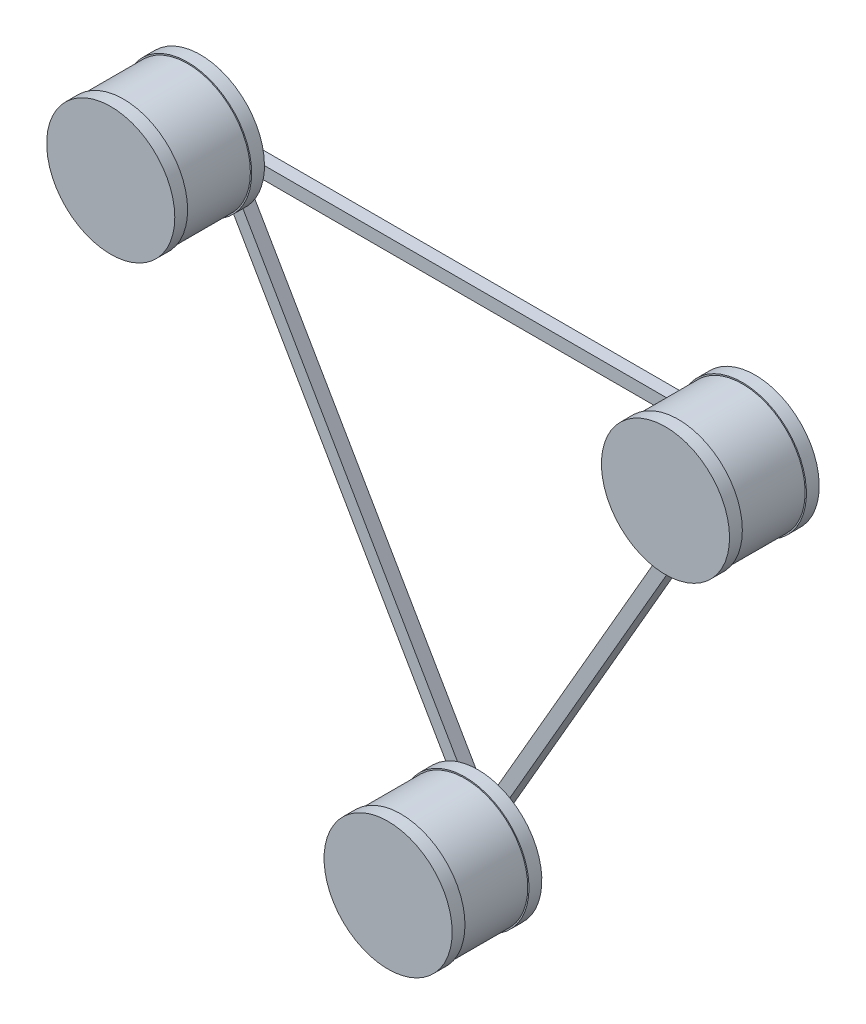
ISO-10303-21;
HEADER;
FILE_DESCRIPTION(('STEP AP214'),'2;1');
FILE_NAME('part.step','',(''),(''),'','','');
FILE_SCHEMA(('AUTOMOTIVE_DESIGN { 1 0 10303 214 1 1 1 1 }'));
ENDSEC;
DATA;
#1=APPLICATION_CONTEXT('core data for automotive mechanical design processes');
#2=APPLICATION_PROTOCOL_DEFINITION('international standard','automotive_design',2000,#1);
#3=PRODUCT_CONTEXT('',#1,'mechanical');
#4=PRODUCT('Part','Part','',(#3));
#5=PRODUCT_RELATED_PRODUCT_CATEGORY('part','',(#4));
#6=PRODUCT_DEFINITION_FORMATION('','',#4);
#7=PRODUCT_DEFINITION_CONTEXT('part definition',#1,'design');
#8=PRODUCT_DEFINITION('design','',#6,#7);
#9=PRODUCT_DEFINITION_SHAPE('','',#8);
#10=(LENGTH_UNIT() NAMED_UNIT(*) SI_UNIT(.MILLI.,.METRE.));
#11=(NAMED_UNIT(*) PLANE_ANGLE_UNIT() SI_UNIT($,.RADIAN.));
#12=(NAMED_UNIT(*) SI_UNIT($,.STERADIAN.) SOLID_ANGLE_UNIT());
#13=UNCERTAINTY_MEASURE_WITH_UNIT(LENGTH_MEASURE(1.E-05),#10,'distance_accuracy_value','');
#14=(GEOMETRIC_REPRESENTATION_CONTEXT(3) GLOBAL_UNCERTAINTY_ASSIGNED_CONTEXT((#13)) GLOBAL_UNIT_ASSIGNED_CONTEXT((#10,
#11,#12)) REPRESENTATION_CONTEXT('',''));
#15=CARTESIAN_POINT('',(0.,0.,0.));
#16=DIRECTION('',(0.,0.,1.));
#17=DIRECTION('',(1.,0.,0.));
#18=AXIS2_PLACEMENT_3D('',#15,#16,#17);
#19=CARTESIAN_POINT('',(0.,0.,2.5));
#20=DIRECTION('',(0.,0.,-1.));
#21=DIRECTION('',(-1.,0.,0.));
#22=AXIS2_PLACEMENT_3D('',#19,#20,#21);
#23=PLANE('',#22);
#24=CARTESIAN_POINT('',(1.79023462720806E-12,-125.,2.5));
#25=DIRECTION('',(0.,0.,1.));
#26=DIRECTION('',(1.,0.,0.));
#27=AXIS2_PLACEMENT_3D('',#24,#25,#26);
#28=CIRCLE('',#27,25.);
#29=CARTESIAN_POINT('',(12.5000000000016,-103.349364905389,2.5));
#30=VERTEX_POINT('',#29);
#31=CARTESIAN_POINT('',(7.91732169499531,-101.286796564404,2.5));
#32=VERTEX_POINT('',#31);
#33=EDGE_CURVE('E147',#30,#32,#28,.T.);
#34=ORIENTED_EDGE('',*,*,#33,.F.);
#35=DIRECTION('',(0.499999999999992,0.866025403784443,0.));
#36=VECTOR('',#35,1.);
#37=CARTESIAN_POINT('',(108.253175473055,62.5000000000005,2.5));
#38=LINE('',#37,#36);
#39=CARTESIAN_POINT('',(95.7531754730548,40.8493649053894,2.5));
#40=VERTEX_POINT('',#39);
#41=EDGE_CURVE('E140',#30,#40,#38,.T.);
#42=ORIENTED_EDGE('',*,*,#41,.T.);
#43=CARTESIAN_POINT('',(108.253175473055,62.5000000000005,2.5));
#44=DIRECTION('',(0.,0.,1.));
#45=DIRECTION('',(-1.,0.,0.));
#46=AXIS2_PLACEMENT_3D('',#43,#44,#45);
#47=CIRCLE('',#46,25.);
#48=CARTESIAN_POINT('',(91.6755997402167,43.7867965644039,2.5));
#49=VERTEX_POINT('',#48);
#50=EDGE_CURVE('E336',#49,#40,#47,.T.);
#51=ORIENTED_EDGE('',*,*,#50,.F.);
#52=DIRECTION('',(0.499999999999992,0.866025403784443,0.));
#53=VECTOR('',#52,1.);
#54=CARTESIAN_POINT('',(99.5929214352103,57.5000000000005,2.5));
#55=LINE('',#54,#53);
#56=EDGE_CURVE('E156',#32,#49,#55,.T.);
#57=ORIENTED_EDGE('',*,*,#56,.F.);
#58=EDGE_LOOP('',(#34,#42,#51,#57));
#59=FACE_BOUND('',#58,.T.);
#60=ADVANCED_FACE('F36',(#59),#23,.F.);
#61=CARTESIAN_POINT('',(83.2531754730546,62.5000000000005,2.5));
#62=VERTEX_POINT('',#61);
#63=CARTESIAN_POINT('',(83.7582780452227,57.5000000000005,2.5));
#64=VERTEX_POINT('',#63);
#65=EDGE_CURVE('E52',#62,#64,#47,.T.);
#66=ORIENTED_EDGE('',*,*,#65,.F.);
#67=DIRECTION('',(-1.,0.,0.));
#68=VECTOR('',#67,1.);
#69=CARTESIAN_POINT('',(-108.253175473055,62.5000000000005,2.5));
#70=LINE('',#69,#68);
#71=CARTESIAN_POINT('',(-83.2531754730546,62.5000000000005,2.5));
#72=VERTEX_POINT('',#71);
#73=EDGE_CURVE('E174',#62,#72,#70,.T.);
#74=ORIENTED_EDGE('',*,*,#73,.T.);
#75=CARTESIAN_POINT('',(-108.253175473055,62.5000000000005,2.5));
#76=DIRECTION('',(0.,0.,1.));
#77=DIRECTION('',(1.,0.,0.));
#78=AXIS2_PLACEMENT_3D('',#75,#76,#77);
#79=CIRCLE('',#78,25.);
#80=CARTESIAN_POINT('',(-83.7582780452228,57.5000000000005,2.5));
#81=VERTEX_POINT('',#80);
#82=EDGE_CURVE('E189',#81,#72,#79,.T.);
#83=ORIENTED_EDGE('',*,*,#82,.F.);
#84=DIRECTION('',(-1.,0.,0.));
#85=VECTOR('',#84,1.);
#86=CARTESIAN_POINT('',(-99.59292143521,57.5000000000005,2.5));
#87=LINE('',#86,#85);
#88=EDGE_CURVE('E60',#64,#81,#87,.T.);
#89=ORIENTED_EDGE('',*,*,#88,.F.);
#90=EDGE_LOOP('',(#66,#74,#83,#89));
#91=FACE_BOUND('',#90,.T.);
#92=ADVANCED_FACE('F337',(#91),#23,.F.);
#93=CARTESIAN_POINT('',(-7.91732169499188,-101.286796564404,2.5));
#94=VERTEX_POINT('',#93);
#95=CARTESIAN_POINT('',(-12.4999999999983,-103.349364905389,2.5));
#96=VERTEX_POINT('',#95);
#97=EDGE_CURVE('E150',#94,#96,#28,.T.);
#98=ORIENTED_EDGE('',*,*,#97,.F.);
#99=DIRECTION('',(0.500000000000004,-0.866025403784436,0.));
#100=VECTOR('',#99,1.);
#101=CARTESIAN_POINT('',(1.82611279708243E-12,-115.,2.5));
#102=LINE('',#101,#100);
#103=CARTESIAN_POINT('',(-91.6755997402163,43.7867965644043,2.5));
#104=VERTEX_POINT('',#103);
#105=EDGE_CURVE('E275',#104,#94,#102,.T.);
#106=ORIENTED_EDGE('',*,*,#105,.F.);
#107=CARTESIAN_POINT('',(-95.7531754730545,40.8493649053896,2.5));
#108=VERTEX_POINT('',#107);
#109=EDGE_CURVE('E243',#108,#104,#79,.T.);
#110=ORIENTED_EDGE('',*,*,#109,.F.);
#111=DIRECTION('',(0.500000000000004,-0.866025403784436,0.));
#112=VECTOR('',#111,1.);
#113=CARTESIAN_POINT('',(1.79023462720806E-12,-125.,2.5));
#114=LINE('',#113,#112);
#115=EDGE_CURVE('E173',#108,#96,#114,.T.);
#116=ORIENTED_EDGE('',*,*,#115,.T.);
#117=EDGE_LOOP('',(#98,#106,#110,#116));
#118=FACE_BOUND('',#117,.T.);
#119=ADVANCED_FACE('F305',(#118),#23,.F.);
#120=CARTESIAN_POINT('',(0.,0.,-2.5));
#121=DIRECTION('',(0.,0.,-1.));
#122=DIRECTION('',(-1.,0.,0.));
#123=AXIS2_PLACEMENT_3D('',#120,#121,#122);
#124=PLANE('',#123);
#125=DIRECTION('',(0.499999999999992,0.866025403784443,0.));
#126=VECTOR('',#125,1.);
#127=CARTESIAN_POINT('',(108.253175473055,62.5000000000005,-2.5));
#128=LINE('',#127,#126);
#129=CARTESIAN_POINT('',(1.79023462720806E-12,-125.,-2.5));
#130=VERTEX_POINT('',#129);
#131=CARTESIAN_POINT('',(108.253175473055,62.5000000000005,-2.5));
#132=VERTEX_POINT('',#131);
#133=EDGE_CURVE('E179',#130,#132,#128,.T.);
#134=ORIENTED_EDGE('',*,*,#133,.F.);
#135=DIRECTION('',(0.500000000000004,-0.866025403784436,0.));
#136=VECTOR('',#135,1.);
#137=CARTESIAN_POINT('',(1.79023462720806E-12,-125.,-2.5));
#138=LINE('',#137,#136);
#139=CARTESIAN_POINT('',(-108.253175473055,62.5000000000005,-2.5));
#140=VERTEX_POINT('',#139);
#141=EDGE_CURVE('E164',#140,#130,#138,.T.);
#142=ORIENTED_EDGE('',*,*,#141,.F.);
#143=DIRECTION('',(-1.,0.,0.));
#144=VECTOR('',#143,1.);
#145=CARTESIAN_POINT('',(-108.253175473055,62.5000000000005,-2.5));
#146=LINE('',#145,#144);
#147=EDGE_CURVE('E165',#132,#140,#146,.T.);
#148=ORIENTED_EDGE('',*,*,#147,.F.);
#149=EDGE_LOOP('',(#134,#142,#148));
#150=FACE_BOUND('',#149,.T.);
#151=DIRECTION('',(0.500000000000004,-0.866025403784436,0.));
#152=VECTOR('',#151,1.);
#153=CARTESIAN_POINT('',(1.82611279708243E-12,-115.,-2.5));
#154=LINE('',#153,#152);
#155=CARTESIAN_POINT('',(-99.59292143521,57.5000000000005,-2.5));
#156=VERTEX_POINT('',#155);
#157=CARTESIAN_POINT('',(1.8249290967276E-12,-115.,-2.5));
#158=VERTEX_POINT('',#157);
#159=EDGE_CURVE('E281',#156,#158,#154,.T.);
#160=ORIENTED_EDGE('',*,*,#159,.T.);
#161=DIRECTION('',(0.499999999999992,0.866025403784443,0.));
#162=VECTOR('',#161,1.);
#163=CARTESIAN_POINT('',(99.5929214352103,57.5000000000005,-2.5));
#164=LINE('',#163,#162);
#165=CARTESIAN_POINT('',(99.5929214352103,57.5000000000005,-2.5));
#166=VERTEX_POINT('',#165);
#167=EDGE_CURVE('E261',#158,#166,#164,.T.);
#168=ORIENTED_EDGE('',*,*,#167,.T.);
#169=DIRECTION('',(-1.,0.,0.));
#170=VECTOR('',#169,1.);
#171=CARTESIAN_POINT('',(-99.59292143521,57.5000000000005,-2.5));
#172=LINE('',#171,#170);
#173=EDGE_CURVE('E278',#166,#156,#172,.T.);
#174=ORIENTED_EDGE('',*,*,#173,.T.);
#175=EDGE_LOOP('',(#160,#168,#174));
#176=FACE_BOUND('',#175,.T.);
#177=ADVANCED_FACE('F295',(#150,#176),#124,.T.);
#178=CARTESIAN_POINT('',(108.253175473055,62.5000000000005,2.5));
#179=DIRECTION('',(-0.866025403784443,0.499999999999992,0.));
#180=DIRECTION('',(-0.499999999999992,-0.866025403784443,0.));
#181=AXIS2_PLACEMENT_3D('',#178,#179,#180);
#182=PLANE('',#181);
#183=ORIENTED_EDGE('',*,*,#133,.T.);
#184=DIRECTION('',(0.,0.,-1.));
#185=VECTOR('',#184,1.);
#186=CARTESIAN_POINT('',(108.253175473055,62.5000000000005,2.5));
#187=LINE('',#186,#185);
#188=CARTESIAN_POINT('',(108.253175473055,62.5000000000005,2.5));
#189=VERTEX_POINT('',#188);
#190=EDGE_CURVE('E186',#189,#132,#187,.T.);
#191=ORIENTED_EDGE('',*,*,#190,.F.);
#192=DIRECTION('',(-0.499999999999992,-0.866025403784443,0.));
#193=VECTOR('',#192,1.);
#194=CARTESIAN_POINT('',(108.253175473055,62.5000000000005,2.5));
#195=LINE('',#194,#193);
#196=EDGE_CURVE('E163',#189,#40,#195,.T.);
#197=ORIENTED_EDGE('',*,*,#196,.T.);
#198=ORIENTED_EDGE('',*,*,#41,.F.);
#199=CARTESIAN_POINT('',(1.79106473273126E-12,-125.,2.5));
#200=VERTEX_POINT('',#199);
#201=EDGE_CURVE('E128',#200,#30,#38,.T.);
#202=ORIENTED_EDGE('',*,*,#201,.F.);
#203=DIRECTION('',(0.,0.,-1.));
#204=VECTOR('',#203,1.);
#205=CARTESIAN_POINT('',(1.79023462720806E-12,-125.,2.5));
#206=LINE('',#205,#204);
#207=EDGE_CURVE('E178',#200,#130,#206,.T.);
#208=ORIENTED_EDGE('',*,*,#207,.T.);
#209=EDGE_LOOP('',(#183,#191,#197,#198,#202,#208));
#210=FACE_BOUND('',#209,.T.);
#211=ADVANCED_FACE('F38',(#210),#182,.F.);
#212=CARTESIAN_POINT('',(-108.253175473055,62.5000000000005,2.5));
#213=DIRECTION('',(0.,-1.,0.));
#214=DIRECTION('',(0.,0.,-1.));
#215=AXIS2_PLACEMENT_3D('',#212,#213,#214);
#216=PLANE('',#215);
#217=ORIENTED_EDGE('',*,*,#147,.T.);
#218=DIRECTION('',(0.,0.,-1.));
#219=VECTOR('',#218,1.);
#220=CARTESIAN_POINT('',(-108.253175473055,62.5000000000005,2.5));
#221=LINE('',#220,#219);
#222=CARTESIAN_POINT('',(-108.253175473055,62.5000000000005,2.5));
#223=VERTEX_POINT('',#222);
#224=EDGE_CURVE('E183',#223,#140,#221,.T.);
#225=ORIENTED_EDGE('',*,*,#224,.F.);
#226=EDGE_CURVE('E139',#72,#223,#70,.T.);
#227=ORIENTED_EDGE('',*,*,#226,.F.);
#228=ORIENTED_EDGE('',*,*,#73,.F.);
#229=EDGE_CURVE('E171',#189,#62,#70,.T.);
#230=ORIENTED_EDGE('',*,*,#229,.F.);
#231=ORIENTED_EDGE('',*,*,#190,.T.);
#232=EDGE_LOOP('',(#217,#225,#227,#228,#230,#231));
#233=FACE_BOUND('',#232,.T.);
#234=ADVANCED_FACE('F330',(#233),#216,.F.);
#235=CARTESIAN_POINT('',(1.79023462720806E-12,-125.,2.5));
#236=DIRECTION('',(0.866025403784436,0.500000000000004,0.));
#237=DIRECTION('',(-0.500000000000004,0.866025403784436,0.));
#238=AXIS2_PLACEMENT_3D('',#235,#236,#237);
#239=PLANE('',#238);
#240=ORIENTED_EDGE('',*,*,#141,.T.);
#241=ORIENTED_EDGE('',*,*,#207,.F.);
#242=DIRECTION('',(0.500000000000004,-0.866025403784436,0.));
#243=VECTOR('',#242,1.);
#244=CARTESIAN_POINT('',(1.79023462720806E-12,-125.,2.5));
#245=LINE('',#244,#243);
#246=EDGE_CURVE('E134',#96,#200,#245,.T.);
#247=ORIENTED_EDGE('',*,*,#246,.F.);
#248=ORIENTED_EDGE('',*,*,#115,.F.);
#249=EDGE_CURVE('E175',#223,#108,#114,.T.);
#250=ORIENTED_EDGE('',*,*,#249,.F.);
#251=ORIENTED_EDGE('',*,*,#224,.T.);
#252=EDGE_LOOP('',(#240,#241,#247,#248,#250,#251));
#253=FACE_BOUND('',#252,.T.);
#254=ADVANCED_FACE('F324',(#253),#239,.F.);
#255=CARTESIAN_POINT('',(99.5929214352103,57.5000000000005,2.5));
#256=DIRECTION('',(-0.866025403784443,0.499999999999992,0.));
#257=DIRECTION('',(-0.499999999999992,-0.866025403784443,0.));
#258=AXIS2_PLACEMENT_3D('',#255,#256,#257);
#259=PLANE('',#258);
#260=ORIENTED_EDGE('',*,*,#167,.F.);
#261=DIRECTION('',(0.,0.,-1.));
#262=VECTOR('',#261,1.);
#263=CARTESIAN_POINT('',(1.82611279708243E-12,-115.,2.5));
#264=LINE('',#263,#262);
#265=CARTESIAN_POINT('',(1.82611279708243E-12,-115.,2.5));
#266=VERTEX_POINT('',#265);
#267=EDGE_CURVE('E274',#266,#158,#264,.T.);
#268=ORIENTED_EDGE('',*,*,#267,.F.);
#269=EDGE_CURVE('E265',#266,#32,#55,.T.);
#270=ORIENTED_EDGE('',*,*,#269,.T.);
#271=ORIENTED_EDGE('',*,*,#56,.T.);
#272=DIRECTION('',(-0.499999999999992,-0.866025403784443,0.));
#273=VECTOR('',#272,1.);
#274=CARTESIAN_POINT('',(99.5929214352103,57.5000000000005,2.5));
#275=LINE('',#274,#273);
#276=CARTESIAN_POINT('',(99.5929214352103,57.5000000000005,2.5));
#277=VERTEX_POINT('',#276);
#278=EDGE_CURVE('E251',#277,#49,#275,.T.);
#279=ORIENTED_EDGE('',*,*,#278,.F.);
#280=DIRECTION('',(0.,0.,-1.));
#281=VECTOR('',#280,1.);
#282=CARTESIAN_POINT('',(99.5929214352103,57.5000000000005,2.5));
#283=LINE('',#282,#281);
#284=EDGE_CURVE('E169',#277,#166,#283,.T.);
#285=ORIENTED_EDGE('',*,*,#284,.T.);
#286=EDGE_LOOP('',(#260,#268,#270,#271,#279,#285));
#287=FACE_BOUND('',#286,.T.);
#288=ADVANCED_FACE('F292',(#287),#259,.T.);
#289=CARTESIAN_POINT('',(-99.59292143521,57.5000000000005,2.5));
#290=DIRECTION('',(0.,-1.,0.));
#291=DIRECTION('',(1.,0.,0.));
#292=AXIS2_PLACEMENT_3D('',#289,#290,#291);
#293=PLANE('',#292);
#294=ORIENTED_EDGE('',*,*,#173,.F.);
#295=ORIENTED_EDGE('',*,*,#284,.F.);
#296=EDGE_CURVE('E268',#277,#64,#87,.T.);
#297=ORIENTED_EDGE('',*,*,#296,.T.);
#298=ORIENTED_EDGE('',*,*,#88,.T.);
#299=CARTESIAN_POINT('',(-99.59292143521,57.5000000000005,2.5));
#300=VERTEX_POINT('',#299);
#301=EDGE_CURVE('E267',#81,#300,#87,.T.);
#302=ORIENTED_EDGE('',*,*,#301,.T.);
#303=DIRECTION('',(0.,0.,-1.));
#304=VECTOR('',#303,1.);
#305=CARTESIAN_POINT('',(-99.59292143521,57.5000000000005,2.5));
#306=LINE('',#305,#304);
#307=EDGE_CURVE('E285',#300,#156,#306,.T.);
#308=ORIENTED_EDGE('',*,*,#307,.T.);
#309=EDGE_LOOP('',(#294,#295,#297,#298,#302,#308));
#310=FACE_BOUND('',#309,.T.);
#311=ADVANCED_FACE('F338',(#310),#293,.T.);
#312=CARTESIAN_POINT('',(1.82611279708243E-12,-115.,2.5));
#313=DIRECTION('',(0.866025403784436,0.500000000000004,0.));
#314=DIRECTION('',(-0.500000000000004,0.866025403784436,0.));
#315=AXIS2_PLACEMENT_3D('',#312,#313,#314);
#316=PLANE('',#315);
#317=ORIENTED_EDGE('',*,*,#159,.F.);
#318=ORIENTED_EDGE('',*,*,#307,.F.);
#319=EDGE_CURVE('E271',#300,#104,#102,.T.);
#320=ORIENTED_EDGE('',*,*,#319,.T.);
#321=ORIENTED_EDGE('',*,*,#105,.T.);
#322=EDGE_CURVE('E270',#94,#266,#102,.T.);
#323=ORIENTED_EDGE('',*,*,#322,.T.);
#324=ORIENTED_EDGE('',*,*,#267,.T.);
#325=EDGE_LOOP('',(#317,#318,#320,#321,#323,#324));
#326=FACE_BOUND('',#325,.T.);
#327=ADVANCED_FACE('F297',(#326),#316,.T.);
#328=CARTESIAN_POINT('',(-108.253175473055,62.5000000000005,2.5));
#329=DIRECTION('',(0.,0.,1.));
#330=DIRECTION('',(1.,0.,0.));
#331=AXIS2_PLACEMENT_3D('',#328,#329,#330);
#332=PLANE('',#331);
#333=EDGE_CURVE('E262',#72,#108,#79,.T.);
#334=ORIENTED_EDGE('',*,*,#333,.F.);
#335=ORIENTED_EDGE('',*,*,#226,.T.);
#336=ORIENTED_EDGE('',*,*,#249,.T.);
#337=EDGE_LOOP('',(#334,#335,#336));
#338=FACE_BOUND('',#337,.T.);
#339=ADVANCED_FACE('F320',(#338),#332,.F.);
#340=CARTESIAN_POINT('',(-108.253175473055,62.5000000000005,7.5));
#341=DIRECTION('',(0.,0.,-1.));
#342=DIRECTION('',(-1.,0.,0.));
#343=AXIS2_PLACEMENT_3D('',#340,#341,#342);
#344=CYLINDRICAL_SURFACE('',#343,25.);
#345=CARTESIAN_POINT('',(-108.253175473055,62.5000000000005,7.5));
#346=DIRECTION('',(0.,0.,1.));
#347=DIRECTION('',(1.,0.,0.));
#348=AXIS2_PLACEMENT_3D('',#345,#346,#347);
#349=CIRCLE('',#348,25.);
#350=CARTESIAN_POINT('',(-83.2531754730546,62.5000000000005,7.5));
#351=VERTEX_POINT('',#350);
#352=EDGE_CURVE('E258',#351,#351,#349,.T.);
#353=ORIENTED_EDGE('',*,*,#352,.F.);
#354=EDGE_LOOP('',(#353));
#355=FACE_BOUND('',#354,.T.);
#356=ORIENTED_EDGE('',*,*,#333,.T.);
#357=ORIENTED_EDGE('',*,*,#109,.T.);
#358=EDGE_CURVE('E257',#104,#81,#79,.T.);
#359=ORIENTED_EDGE('',*,*,#358,.T.);
#360=ORIENTED_EDGE('',*,*,#82,.T.);
#361=EDGE_LOOP('',(#356,#357,#359,#360));
#362=FACE_BOUND('',#361,.T.);
#363=ADVANCED_FACE('F315',(#355,#362),#344,.T.);
#364=CARTESIAN_POINT('',(-108.253175473055,62.5000000000005,7.5));
#365=DIRECTION('',(0.,0.,1.));
#366=DIRECTION('',(1.,0.,0.));
#367=AXIS2_PLACEMENT_3D('',#364,#365,#366);
#368=PLANE('',#367);
#369=CARTESIAN_POINT('',(-108.253175473055,62.5000000000005,7.5));
#370=DIRECTION('',(0.,0.,1.));
#371=DIRECTION('',(1.,0.,0.));
#372=AXIS2_PLACEMENT_3D('',#369,#370,#371);
#373=CIRCLE('',#372,24.5);
#374=CARTESIAN_POINT('',(-83.7531754730546,62.5000000000005,7.5));
#375=VERTEX_POINT('',#374);
#376=EDGE_CURVE('E723',#375,#375,#373,.T.);
#377=ORIENTED_EDGE('',*,*,#376,.F.);
#378=EDGE_LOOP('',(#377));
#379=FACE_BOUND('',#378,.T.);
#380=ORIENTED_EDGE('',*,*,#352,.T.);
#381=EDGE_LOOP('',(#380));
#382=FACE_BOUND('',#381,.T.);
#383=ADVANCED_FACE('F408',(#379,#382),#368,.T.);
#384=ORIENTED_EDGE('',*,*,#319,.F.);
#385=ORIENTED_EDGE('',*,*,#301,.F.);
#386=ORIENTED_EDGE('',*,*,#358,.F.);
#387=EDGE_LOOP('',(#384,#385,#386));
#388=FACE_BOUND('',#387,.T.);
#389=ADVANCED_FACE('F312',(#388),#332,.F.);
#390=CARTESIAN_POINT('',(108.253175473055,62.5000000000005,2.5));
#391=DIRECTION('',(0.,0.,-1.));
#392=DIRECTION('',(-1.,0.,0.));
#393=AXIS2_PLACEMENT_3D('',#390,#391,#392);
#394=PLANE('',#393);
#395=ORIENTED_EDGE('',*,*,#196,.F.);
#396=ORIENTED_EDGE('',*,*,#229,.T.);
#397=EDGE_CURVE('E247',#40,#62,#47,.T.);
#398=ORIENTED_EDGE('',*,*,#397,.F.);
#399=EDGE_LOOP('',(#395,#396,#398));
#400=FACE_BOUND('',#399,.T.);
#401=ADVANCED_FACE('F333',(#400),#394,.T.);
#402=CARTESIAN_POINT('',(108.253175473055,62.5000000000005,7.5));
#403=DIRECTION('',(0.,0.,-1.));
#404=DIRECTION('',(-1.,0.,0.));
#405=AXIS2_PLACEMENT_3D('',#402,#403,#404);
#406=CYLINDRICAL_SURFACE('',#405,25.);
#407=CARTESIAN_POINT('',(108.253175473055,62.5000000000005,7.5));
#408=DIRECTION('',(0.,0.,1.));
#409=DIRECTION('',(-1.,0.,0.));
#410=AXIS2_PLACEMENT_3D('',#407,#408,#409);
#411=CIRCLE('',#410,25.);
#412=CARTESIAN_POINT('',(83.2531754730546,62.5000000000005,7.5));
#413=VERTEX_POINT('',#412);
#414=EDGE_CURVE('E248',#413,#413,#411,.T.);
#415=ORIENTED_EDGE('',*,*,#414,.F.);
#416=EDGE_LOOP('',(#415));
#417=FACE_BOUND('',#416,.T.);
#418=ORIENTED_EDGE('',*,*,#65,.T.);
#419=EDGE_CURVE('E253',#64,#49,#47,.T.);
#420=ORIENTED_EDGE('',*,*,#419,.T.);
#421=ORIENTED_EDGE('',*,*,#50,.T.);
#422=ORIENTED_EDGE('',*,*,#397,.T.);
#423=EDGE_LOOP('',(#418,#420,#421,#422));
#424=FACE_BOUND('',#423,.T.);
#425=ADVANCED_FACE('F335',(#417,#424),#406,.T.);
#426=CARTESIAN_POINT('',(108.253175473055,62.5000000000005,7.5));
#427=DIRECTION('',(0.,0.,-1.));
#428=DIRECTION('',(-1.,0.,0.));
#429=AXIS2_PLACEMENT_3D('',#426,#427,#428);
#430=PLANE('',#429);
#431=CARTESIAN_POINT('',(108.253175473055,62.5000000000005,7.50000000000001));
#432=DIRECTION('',(0.,0.,-1.));
#433=DIRECTION('',(-1.,0.,0.));
#434=AXIS2_PLACEMENT_3D('',#431,#432,#433);
#435=CIRCLE('',#434,24.5);
#436=CARTESIAN_POINT('',(83.7531754730545,62.5000000000005,7.50000000000001));
#437=VERTEX_POINT('',#436);
#438=EDGE_CURVE('E200',#437,#437,#435,.F.);
#439=ORIENTED_EDGE('',*,*,#438,.F.);
#440=EDGE_LOOP('',(#439));
#441=FACE_BOUND('',#440,.T.);
#442=ORIENTED_EDGE('',*,*,#414,.T.);
#443=EDGE_LOOP('',(#442));
#444=FACE_BOUND('',#443,.T.);
#445=ADVANCED_FACE('F342',(#441,#444),#430,.F.);
#446=ORIENTED_EDGE('',*,*,#296,.F.);
#447=ORIENTED_EDGE('',*,*,#278,.T.);
#448=ORIENTED_EDGE('',*,*,#419,.F.);
#449=EDGE_LOOP('',(#446,#447,#448));
#450=FACE_BOUND('',#449,.T.);
#451=ADVANCED_FACE('F340',(#450),#394,.T.);
#452=CARTESIAN_POINT('',(1.79023462720806E-12,-125.,2.5));
#453=DIRECTION('',(0.,0.,1.));
#454=DIRECTION('',(1.,0.,0.));
#455=AXIS2_PLACEMENT_3D('',#452,#453,#454);
#456=PLANE('',#455);
#457=ORIENTED_EDGE('',*,*,#246,.T.);
#458=ORIENTED_EDGE('',*,*,#201,.T.);
#459=EDGE_CURVE('E131',#96,#30,#28,.T.);
#460=ORIENTED_EDGE('',*,*,#459,.F.);
#461=EDGE_LOOP('',(#457,#458,#460));
#462=FACE_BOUND('',#461,.T.);
#463=ADVANCED_FACE('F130',(#462),#456,.F.);
#464=CARTESIAN_POINT('',(1.79023462720806E-12,-125.,7.5));
#465=DIRECTION('',(0.,0.,-1.));
#466=DIRECTION('',(-1.,0.,0.));
#467=AXIS2_PLACEMENT_3D('',#464,#465,#466);
#468=CYLINDRICAL_SURFACE('',#467,25.);
#469=CARTESIAN_POINT('',(1.79023462720806E-12,-125.,7.5));
#470=DIRECTION('',(0.,0.,1.));
#471=DIRECTION('',(1.,0.,0.));
#472=AXIS2_PLACEMENT_3D('',#469,#470,#471);
#473=CIRCLE('',#472,25.);
#474=CARTESIAN_POINT('',(25.0000000000018,-125.,7.5));
#475=VERTEX_POINT('',#474);
#476=EDGE_CURVE('E158',#475,#475,#473,.T.);
#477=ORIENTED_EDGE('',*,*,#476,.F.);
#478=EDGE_LOOP('',(#477));
#479=FACE_BOUND('',#478,.T.);
#480=ORIENTED_EDGE('',*,*,#33,.T.);
#481=EDGE_CURVE('E159',#32,#94,#28,.T.);
#482=ORIENTED_EDGE('',*,*,#481,.T.);
#483=ORIENTED_EDGE('',*,*,#97,.T.);
#484=ORIENTED_EDGE('',*,*,#459,.T.);
#485=EDGE_LOOP('',(#480,#482,#483,#484));
#486=FACE_BOUND('',#485,.T.);
#487=ADVANCED_FACE('F145',(#479,#486),#468,.T.);
#488=CARTESIAN_POINT('',(1.79023462720806E-12,-125.,7.5));
#489=DIRECTION('',(0.,0.,1.));
#490=DIRECTION('',(1.,0.,0.));
#491=AXIS2_PLACEMENT_3D('',#488,#489,#490);
#492=PLANE('',#491);
#493=CARTESIAN_POINT('',(1.79023462720806E-12,-125.,7.5));
#494=DIRECTION('',(0.,0.,1.));
#495=DIRECTION('',(1.,0.,0.));
#496=AXIS2_PLACEMENT_3D('',#493,#494,#495);
#497=CIRCLE('',#496,24.5);
#498=CARTESIAN_POINT('',(24.5000000000018,-125.,7.5));
#499=VERTEX_POINT('',#498);
#500=EDGE_CURVE('E747',#499,#499,#497,.T.);
#501=ORIENTED_EDGE('',*,*,#500,.F.);
#502=EDGE_LOOP('',(#501));
#503=FACE_BOUND('',#502,.T.);
#504=ORIENTED_EDGE('',*,*,#476,.T.);
#505=EDGE_LOOP('',(#504));
#506=FACE_BOUND('',#505,.T.);
#507=ADVANCED_FACE('F444',(#503,#506),#492,.T.);
#508=ORIENTED_EDGE('',*,*,#269,.F.);
#509=ORIENTED_EDGE('',*,*,#322,.F.);
#510=ORIENTED_EDGE('',*,*,#481,.F.);
#511=EDGE_LOOP('',(#508,#509,#510));
#512=FACE_BOUND('',#511,.T.);
#513=ADVANCED_FACE('F302',(#512),#456,.F.);
#514=CARTESIAN_POINT('',(-108.253175473055,62.5000000000005,101.796464556282));
#515=DIRECTION('',(0.,0.,-1.));
#516=DIRECTION('',(-1.,0.,0.));
#517=AXIS2_PLACEMENT_3D('',#514,#515,#516);
#518=CYLINDRICAL_SURFACE('',#517,24.5);
#519=ORIENTED_EDGE('',*,*,#376,.T.);
#520=EDGE_LOOP('',(#519));
#521=FACE_BOUND('',#520,.T.);
#522=CARTESIAN_POINT('',(-108.253175473055,62.5000000000005,32.5));
#523=DIRECTION('',(0.,0.,1.));
#524=DIRECTION('',(1.,0.,0.));
#525=AXIS2_PLACEMENT_3D('',#522,#523,#524);
#526=CIRCLE('',#525,24.5);
#527=CARTESIAN_POINT('',(-83.7531754730546,62.5000000000005,32.5));
#528=VERTEX_POINT('',#527);
#529=EDGE_CURVE('E190',#528,#528,#526,.F.);
#530=ORIENTED_EDGE('',*,*,#529,.T.);
#531=EDGE_LOOP('',(#530));
#532=FACE_BOUND('',#531,.T.);
#533=ADVANCED_FACE('F459',(#521,#532),#518,.T.);
#534=CARTESIAN_POINT('',(-108.253175473055,62.5000000000005,37.5));
#535=DIRECTION('',(0.,0.,1.));
#536=DIRECTION('',(1.,0.,0.));
#537=AXIS2_PLACEMENT_3D('',#534,#535,#536);
#538=PLANE('',#537);
#539=CARTESIAN_POINT('',(-108.253175473055,62.5000000000005,37.5));
#540=DIRECTION('',(0.,0.,1.));
#541=DIRECTION('',(1.,0.,0.));
#542=AXIS2_PLACEMENT_3D('',#539,#540,#541);
#543=CIRCLE('',#542,25.);
#544=CARTESIAN_POINT('',(-83.2531754730546,62.5000000000005,37.5));
#545=VERTEX_POINT('',#544);
#546=EDGE_CURVE('E734',#545,#545,#543,.T.);
#547=ORIENTED_EDGE('',*,*,#546,.T.);
#548=EDGE_LOOP('',(#547));
#549=FACE_BOUND('',#548,.T.);
#550=ADVANCED_FACE('F465',(#549),#538,.T.);
#551=CARTESIAN_POINT('',(-108.253175473055,62.5000000000005,37.5));
#552=DIRECTION('',(0.,0.,-1.));
#553=DIRECTION('',(-1.,0.,0.));
#554=AXIS2_PLACEMENT_3D('',#551,#552,#553);
#555=CYLINDRICAL_SURFACE('',#554,25.);
#556=ORIENTED_EDGE('',*,*,#546,.F.);
#557=EDGE_LOOP('',(#556));
#558=FACE_BOUND('',#557,.T.);
#559=CARTESIAN_POINT('',(-108.253175473055,62.5000000000005,32.5));
#560=DIRECTION('',(0.,0.,1.));
#561=DIRECTION('',(1.,0.,0.));
#562=AXIS2_PLACEMENT_3D('',#559,#560,#561);
#563=CIRCLE('',#562,25.);
#564=CARTESIAN_POINT('',(-83.2531754730546,62.5000000000005,32.5));
#565=VERTEX_POINT('',#564);
#566=EDGE_CURVE('E727',#565,#565,#563,.T.);
#567=ORIENTED_EDGE('',*,*,#566,.T.);
#568=EDGE_LOOP('',(#567));
#569=FACE_BOUND('',#568,.T.);
#570=ADVANCED_FACE('F479',(#558,#569),#555,.T.);
#571=CARTESIAN_POINT('',(-108.253175473055,62.5000000000005,32.5));
#572=DIRECTION('',(0.,0.,1.));
#573=DIRECTION('',(1.,0.,0.));
#574=AXIS2_PLACEMENT_3D('',#571,#572,#573);
#575=PLANE('',#574);
#576=ORIENTED_EDGE('',*,*,#529,.F.);
#577=EDGE_LOOP('',(#576));
#578=FACE_BOUND('',#577,.T.);
#579=ORIENTED_EDGE('',*,*,#566,.F.);
#580=EDGE_LOOP('',(#579));
#581=FACE_BOUND('',#580,.T.);
#582=ADVANCED_FACE('F473',(#578,#581),#575,.F.);
#583=CARTESIAN_POINT('',(108.253175473055,62.5000000000005,101.796464556282));
#584=DIRECTION('',(0.,0.,-1.));
#585=DIRECTION('',(-1.,0.,0.));
#586=AXIS2_PLACEMENT_3D('',#583,#584,#585);
#587=CYLINDRICAL_SURFACE('',#586,24.5);
#588=ORIENTED_EDGE('',*,*,#438,.T.);
#589=EDGE_LOOP('',(#588));
#590=FACE_BOUND('',#589,.T.);
#591=CARTESIAN_POINT('',(108.253175473055,62.5000000000005,32.5));
#592=DIRECTION('',(0.,0.,1.));
#593=DIRECTION('',(1.,0.,0.));
#594=AXIS2_PLACEMENT_3D('',#591,#592,#593);
#595=CIRCLE('',#594,24.5);
#596=CARTESIAN_POINT('',(132.753175473055,62.5000000000005,32.5));
#597=VERTEX_POINT('',#596);
#598=EDGE_CURVE('E197',#597,#597,#595,.F.);
#599=ORIENTED_EDGE('',*,*,#598,.T.);
#600=EDGE_LOOP('',(#599));
#601=FACE_BOUND('',#600,.T.);
#602=ADVANCED_FACE('F478',(#590,#601),#587,.T.);
#603=CARTESIAN_POINT('',(108.253175473055,62.5000000000005,37.5));
#604=DIRECTION('',(0.,0.,1.));
#605=DIRECTION('',(1.,0.,0.));
#606=AXIS2_PLACEMENT_3D('',#603,#604,#605);
#607=PLANE('',#606);
#608=CARTESIAN_POINT('',(108.253175473055,62.5000000000005,37.5));
#609=DIRECTION('',(0.,0.,1.));
#610=DIRECTION('',(1.,0.,0.));
#611=AXIS2_PLACEMENT_3D('',#608,#609,#610);
#612=CIRCLE('',#611,25.);
#613=CARTESIAN_POINT('',(133.253175473055,62.5000000000005,37.5));
#614=VERTEX_POINT('',#613);
#615=EDGE_CURVE('E218',#614,#614,#612,.T.);
#616=ORIENTED_EDGE('',*,*,#615,.T.);
#617=EDGE_LOOP('',(#616));
#618=FACE_BOUND('',#617,.T.);
#619=ADVANCED_FACE('F492',(#618),#607,.T.);
#620=CARTESIAN_POINT('',(108.253175473055,62.5000000000005,37.5));
#621=DIRECTION('',(0.,0.,-1.));
#622=DIRECTION('',(-1.,0.,0.));
#623=AXIS2_PLACEMENT_3D('',#620,#621,#622);
#624=CYLINDRICAL_SURFACE('',#623,25.);
#625=ORIENTED_EDGE('',*,*,#615,.F.);
#626=EDGE_LOOP('',(#625));
#627=FACE_BOUND('',#626,.T.);
#628=CARTESIAN_POINT('',(108.253175473055,62.5000000000005,32.5));
#629=DIRECTION('',(0.,0.,1.));
#630=DIRECTION('',(1.,0.,0.));
#631=AXIS2_PLACEMENT_3D('',#628,#629,#630);
#632=CIRCLE('',#631,25.);
#633=CARTESIAN_POINT('',(133.253175473055,62.5000000000005,32.5));
#634=VERTEX_POINT('',#633);
#635=EDGE_CURVE('E224',#634,#634,#632,.T.);
#636=ORIENTED_EDGE('',*,*,#635,.T.);
#637=EDGE_LOOP('',(#636));
#638=FACE_BOUND('',#637,.T.);
#639=ADVANCED_FACE('F505',(#627,#638),#624,.T.);
#640=CARTESIAN_POINT('',(108.253175473055,62.5000000000005,32.5));
#641=DIRECTION('',(0.,0.,1.));
#642=DIRECTION('',(1.,0.,0.));
#643=AXIS2_PLACEMENT_3D('',#640,#641,#642);
#644=PLANE('',#643);
#645=ORIENTED_EDGE('',*,*,#598,.F.);
#646=EDGE_LOOP('',(#645));
#647=FACE_BOUND('',#646,.T.);
#648=ORIENTED_EDGE('',*,*,#635,.F.);
#649=EDGE_LOOP('',(#648));
#650=FACE_BOUND('',#649,.T.);
#651=ADVANCED_FACE('F500',(#647,#650),#644,.F.);
#652=CARTESIAN_POINT('',(1.79023462720806E-12,-125.,101.796464556282));
#653=DIRECTION('',(0.,0.,-1.));
#654=DIRECTION('',(-1.,0.,0.));
#655=AXIS2_PLACEMENT_3D('',#652,#653,#654);
#656=CYLINDRICAL_SURFACE('',#655,24.5);
#657=ORIENTED_EDGE('',*,*,#500,.T.);
#658=EDGE_LOOP('',(#657));
#659=FACE_BOUND('',#658,.T.);
#660=CARTESIAN_POINT('',(1.79023462720806E-12,-125.,32.5));
#661=DIRECTION('',(0.,0.,1.));
#662=DIRECTION('',(1.,0.,0.));
#663=AXIS2_PLACEMENT_3D('',#660,#661,#662);
#664=CIRCLE('',#663,24.5);
#665=CARTESIAN_POINT('',(24.5000000000018,-125.,32.5));
#666=VERTEX_POINT('',#665);
#667=EDGE_CURVE('E45',#666,#666,#664,.F.);
#668=ORIENTED_EDGE('',*,*,#667,.T.);
#669=EDGE_LOOP('',(#668));
#670=FACE_BOUND('',#669,.T.);
#671=ADVANCED_FACE('F205',(#659,#670),#656,.T.);
#672=CARTESIAN_POINT('',(1.79023462720806E-12,-125.,37.5));
#673=DIRECTION('',(0.,0.,1.));
#674=DIRECTION('',(1.,0.,0.));
#675=AXIS2_PLACEMENT_3D('',#672,#673,#674);
#676=PLANE('',#675);
#677=CARTESIAN_POINT('',(1.79023462720806E-12,-125.,37.5));
#678=DIRECTION('',(0.,0.,1.));
#679=DIRECTION('',(1.,0.,0.));
#680=AXIS2_PLACEMENT_3D('',#677,#678,#679);
#681=CIRCLE('',#680,25.);
#682=CARTESIAN_POINT('',(25.0000000000018,-125.,37.5));
#683=VERTEX_POINT('',#682);
#684=EDGE_CURVE('E217',#683,#683,#681,.T.);
#685=ORIENTED_EDGE('',*,*,#684,.T.);
#686=EDGE_LOOP('',(#685));
#687=FACE_BOUND('',#686,.T.);
#688=ADVANCED_FACE('F518',(#687),#676,.T.);
#689=CARTESIAN_POINT('',(1.79023462720806E-12,-125.,37.5));
#690=DIRECTION('',(0.,0.,-1.));
#691=DIRECTION('',(-1.,0.,0.));
#692=AXIS2_PLACEMENT_3D('',#689,#690,#691);
#693=CYLINDRICAL_SURFACE('',#692,25.);
#694=ORIENTED_EDGE('',*,*,#684,.F.);
#695=EDGE_LOOP('',(#694));
#696=FACE_BOUND('',#695,.T.);
#697=CARTESIAN_POINT('',(1.79023462720806E-12,-125.,32.5));
#698=DIRECTION('',(0.,0.,1.));
#699=DIRECTION('',(1.,0.,0.));
#700=AXIS2_PLACEMENT_3D('',#697,#698,#699);
#701=CIRCLE('',#700,25.);
#702=CARTESIAN_POINT('',(25.0000000000018,-125.,32.5));
#703=VERTEX_POINT('',#702);
#704=EDGE_CURVE('E215',#703,#703,#701,.T.);
#705=ORIENTED_EDGE('',*,*,#704,.T.);
#706=EDGE_LOOP('',(#705));
#707=FACE_BOUND('',#706,.T.);
#708=ADVANCED_FACE('F210',(#696,#707),#693,.T.);
#709=CARTESIAN_POINT('',(1.79023462720806E-12,-125.,32.5));
#710=DIRECTION('',(0.,0.,1.));
#711=DIRECTION('',(1.,0.,0.));
#712=AXIS2_PLACEMENT_3D('',#709,#710,#711);
#713=PLANE('',#712);
#714=ORIENTED_EDGE('',*,*,#667,.F.);
#715=EDGE_LOOP('',(#714));
#716=FACE_BOUND('',#715,.T.);
#717=ORIENTED_EDGE('',*,*,#704,.F.);
#718=EDGE_LOOP('',(#717));
#719=FACE_BOUND('',#718,.T.);
#720=ADVANCED_FACE('F207',(#716,#719),#713,.F.);
#721=CLOSED_SHELL('',(#60,#92,#119,#177,#211,#234,#254,#288,#311,#327,#339,#363,#383,#389,#401,
#425,#445,#451,#463,#487,#507,#513,#533,#550,#570,#582,#602,#619,#639,#651,#671,#688,#708,#720));
#722=CARTESIAN_POINT('',(1.79023462720806E-12,-125.,7.5));
#723=DIRECTION('',(0.,0.,1.));
#724=DIRECTION('',(1.,0.,0.));
#725=AXIS2_PLACEMENT_3D('',#722,#723,#724);
#726=CIRCLE('',#725,5.00000000000001);
#727=CARTESIAN_POINT('',(5.0000000000018,-125.,7.5));
#728=VERTEX_POINT('',#727);
#729=EDGE_CURVE('E194',#728,#728,#726,.T.);
#730=ORIENTED_EDGE('',*,*,#729,.F.);
#731=EDGE_LOOP('',(#730));
#732=FACE_BOUND('',#731,.T.);
#733=CARTESIAN_POINT('',(1.79023462720806E-12,-125.,7.50000000000001));
#734=DIRECTION('',(0.,0.,1.));
#735=DIRECTION('',(1.,0.,0.));
#736=AXIS2_PLACEMENT_3D('',#733,#734,#735);
#737=CIRCLE('',#736,5.5);
#738=CARTESIAN_POINT('',(5.50000000000179,-125.,7.50000000000001));
#739=VERTEX_POINT('',#738);
#740=EDGE_CURVE('E11',#739,#739,#737,.F.);
#741=ORIENTED_EDGE('',*,*,#740,.F.);
#742=EDGE_LOOP('',(#741));
#743=FACE_BOUND('',#742,.T.);
#744=ADVANCED_FACE('F451',(#732,#743),#492,.T.);
#745=CARTESIAN_POINT('',(1.79023462720806E-12,-125.,32.5));
#746=DIRECTION('',(0.,0.,-1.));
#747=DIRECTION('',(-1.,0.,0.));
#748=AXIS2_PLACEMENT_3D('',#745,#746,#747);
#749=CYLINDRICAL_SURFACE('',#748,5.00000000000001);
#750=CARTESIAN_POINT('',(1.79023462720806E-12,-125.,32.5));
#751=DIRECTION('',(0.,0.,1.));
#752=DIRECTION('',(1.,0.,0.));
#753=AXIS2_PLACEMENT_3D('',#750,#751,#752);
#754=CIRCLE('',#753,5.00000000000001);
#755=CARTESIAN_POINT('',(5.0000000000018,-125.,32.5));
#756=VERTEX_POINT('',#755);
#757=EDGE_CURVE('E221',#756,#756,#754,.T.);
#758=ORIENTED_EDGE('',*,*,#757,.F.);
#759=EDGE_LOOP('',(#758));
#760=FACE_BOUND('',#759,.T.);
#761=ORIENTED_EDGE('',*,*,#729,.T.);
#762=EDGE_LOOP('',(#761));
#763=FACE_BOUND('',#762,.T.);
#764=ADVANCED_FACE('F538',(#760,#763),#749,.T.);
#765=ORIENTED_EDGE('',*,*,#757,.T.);
#766=EDGE_LOOP('',(#765));
#767=FACE_BOUND('',#766,.T.);
#768=CARTESIAN_POINT('',(1.79023462720806E-12,-125.,32.5));
#769=DIRECTION('',(0.,0.,1.));
#770=DIRECTION('',(1.,0.,0.));
#771=AXIS2_PLACEMENT_3D('',#768,#769,#770);
#772=CIRCLE('',#771,5.5);
#773=CARTESIAN_POINT('',(5.50000000000179,-125.,32.5));
#774=VERTEX_POINT('',#773);
#775=EDGE_CURVE('E749',#774,#774,#772,.T.);
#776=ORIENTED_EDGE('',*,*,#775,.F.);
#777=EDGE_LOOP('',(#776));
#778=FACE_BOUND('',#777,.T.);
#779=ADVANCED_FACE('F212',(#767,#778),#713,.F.);
#780=CARTESIAN_POINT('',(1.79023462720806E-12,-125.,101.796464556282));
#781=DIRECTION('',(0.,0.,-1.));
#782=DIRECTION('',(-1.,0.,0.));
#783=AXIS2_PLACEMENT_3D('',#780,#781,#782);
#784=CYLINDRICAL_SURFACE('',#783,5.5);
#785=ORIENTED_EDGE('',*,*,#740,.T.);
#786=EDGE_LOOP('',(#785));
#787=FACE_BOUND('',#786,.T.);
#788=ORIENTED_EDGE('',*,*,#775,.T.);
#789=EDGE_LOOP('',(#788));
#790=FACE_BOUND('',#789,.T.);
#791=ADVANCED_FACE('F549',(#787,#790),#784,.F.);
#792=CLOSED_SHELL('',(#744,#764,#779,#791));
#793=CARTESIAN_POINT('',(108.253175473055,62.5000000000005,7.5));
#794=DIRECTION('',(0.,0.,1.));
#795=DIRECTION('',(-1.,0.,0.));
#796=AXIS2_PLACEMENT_3D('',#793,#794,#795);
#797=CIRCLE('',#796,4.99999999999999);
#798=CARTESIAN_POINT('',(103.253175473055,62.5000000000005,7.5));
#799=VERTEX_POINT('',#798);
#800=EDGE_CURVE('E233',#799,#799,#797,.T.);
#801=ORIENTED_EDGE('',*,*,#800,.F.);
#802=EDGE_LOOP('',(#801));
#803=FACE_BOUND('',#802,.T.);
#804=CARTESIAN_POINT('',(108.253175473055,62.5000000000005,7.5));
#805=DIRECTION('',(0.,0.,1.));
#806=DIRECTION('',(1.,0.,0.));
#807=AXIS2_PLACEMENT_3D('',#804,#805,#806);
#808=CIRCLE('',#807,5.50000000000002);
#809=CARTESIAN_POINT('',(113.753175473055,62.5000000000005,7.5));
#810=VERTEX_POINT('',#809);
#811=EDGE_CURVE('E724',#810,#810,#808,.T.);
#812=ORIENTED_EDGE('',*,*,#811,.T.);
#813=EDGE_LOOP('',(#812));
#814=FACE_BOUND('',#813,.T.);
#815=ADVANCED_FACE('F351',(#803,#814),#430,.F.);
#816=CARTESIAN_POINT('',(108.253175473055,62.5000000000005,32.5));
#817=DIRECTION('',(0.,0.,-1.));
#818=DIRECTION('',(-1.,0.,0.));
#819=AXIS2_PLACEMENT_3D('',#816,#817,#818);
#820=CYLINDRICAL_SURFACE('',#819,4.99999999999999);
#821=CARTESIAN_POINT('',(108.253175473055,62.5000000000005,32.5));
#822=DIRECTION('',(0.,0.,1.));
#823=DIRECTION('',(-1.,0.,0.));
#824=AXIS2_PLACEMENT_3D('',#821,#822,#823);
#825=CIRCLE('',#824,4.99999999999999);
#826=CARTESIAN_POINT('',(103.253175473055,62.5000000000005,32.5));
#827=VERTEX_POINT('',#826);
#828=EDGE_CURVE('E230',#827,#827,#825,.T.);
#829=ORIENTED_EDGE('',*,*,#828,.F.);
#830=EDGE_LOOP('',(#829));
#831=FACE_BOUND('',#830,.T.);
#832=ORIENTED_EDGE('',*,*,#800,.T.);
#833=EDGE_LOOP('',(#832));
#834=FACE_BOUND('',#833,.T.);
#835=ADVANCED_FACE('F567',(#831,#834),#820,.T.);
#836=ORIENTED_EDGE('',*,*,#828,.T.);
#837=EDGE_LOOP('',(#836));
#838=FACE_BOUND('',#837,.T.);
#839=CARTESIAN_POINT('',(108.253175473055,62.5000000000005,32.5));
#840=DIRECTION('',(0.,0.,1.));
#841=DIRECTION('',(1.,0.,0.));
#842=AXIS2_PLACEMENT_3D('',#839,#840,#841);
#843=CIRCLE('',#842,5.50000000000002);
#844=CARTESIAN_POINT('',(113.753175473055,62.5000000000005,32.5));
#845=VERTEX_POINT('',#844);
#846=EDGE_CURVE('E730',#845,#845,#843,.T.);
#847=ORIENTED_EDGE('',*,*,#846,.F.);
#848=EDGE_LOOP('',(#847));
#849=FACE_BOUND('',#848,.T.);
#850=ADVANCED_FACE('F508',(#838,#849),#644,.F.);
#851=CARTESIAN_POINT('',(108.253175473055,62.5000000000005,101.796464556282));
#852=DIRECTION('',(0.,0.,-1.));
#853=DIRECTION('',(-1.,0.,0.));
#854=AXIS2_PLACEMENT_3D('',#851,#852,#853);
#855=CYLINDRICAL_SURFACE('',#854,5.50000000000002);
#856=ORIENTED_EDGE('',*,*,#811,.F.);
#857=EDGE_LOOP('',(#856));
#858=FACE_BOUND('',#857,.T.);
#859=ORIENTED_EDGE('',*,*,#846,.T.);
#860=EDGE_LOOP('',(#859));
#861=FACE_BOUND('',#860,.T.);
#862=ADVANCED_FACE('F579',(#858,#861),#855,.F.);
#863=CLOSED_SHELL('',(#815,#835,#850,#862));
#864=CARTESIAN_POINT('',(-108.253175473055,62.5000000000005,7.5));
#865=DIRECTION('',(0.,0.,1.));
#866=DIRECTION('',(1.,0.,0.));
#867=AXIS2_PLACEMENT_3D('',#864,#865,#866);
#868=CIRCLE('',#867,4.99999999999999);
#869=CARTESIAN_POINT('',(-103.253175473055,62.5000000000005,7.5));
#870=VERTEX_POINT('',#869);
#871=EDGE_CURVE('E238',#870,#870,#868,.T.);
#872=ORIENTED_EDGE('',*,*,#871,.F.);
#873=EDGE_LOOP('',(#872));
#874=FACE_BOUND('',#873,.T.);
#875=CARTESIAN_POINT('',(-108.253175473055,62.5000000000005,7.50000000000001));
#876=DIRECTION('',(0.,0.,1.));
#877=DIRECTION('',(1.,0.,0.));
#878=AXIS2_PLACEMENT_3D('',#875,#876,#877);
#879=CIRCLE('',#878,5.50000000000002);
#880=CARTESIAN_POINT('',(-102.753175473055,62.5000000000005,7.50000000000001));
#881=VERTEX_POINT('',#880);
#882=EDGE_CURVE('E193',#881,#881,#879,.F.);
#883=ORIENTED_EDGE('',*,*,#882,.F.);
#884=EDGE_LOOP('',(#883));
#885=FACE_BOUND('',#884,.T.);
#886=ADVANCED_FACE('F419',(#874,#885),#368,.T.);
#887=CARTESIAN_POINT('',(-108.253175473055,62.5000000000005,32.5));
#888=DIRECTION('',(0.,0.,-1.));
#889=DIRECTION('',(-1.,0.,0.));
#890=AXIS2_PLACEMENT_3D('',#887,#888,#889);
#891=CYLINDRICAL_SURFACE('',#890,4.99999999999999);
#892=CARTESIAN_POINT('',(-108.253175473055,62.5000000000005,32.5));
#893=DIRECTION('',(0.,0.,1.));
#894=DIRECTION('',(1.,0.,0.));
#895=AXIS2_PLACEMENT_3D('',#892,#893,#894);
#896=CIRCLE('',#895,4.99999999999999);
#897=CARTESIAN_POINT('',(-103.253175473055,62.5000000000005,32.5));
#898=VERTEX_POINT('',#897);
#899=EDGE_CURVE('E151',#898,#898,#896,.T.);
#900=ORIENTED_EDGE('',*,*,#899,.F.);
#901=EDGE_LOOP('',(#900));
#902=FACE_BOUND('',#901,.T.);
#903=ORIENTED_EDGE('',*,*,#871,.T.);
#904=EDGE_LOOP('',(#903));
#905=FACE_BOUND('',#904,.T.);
#906=ADVANCED_FACE('F597',(#902,#905),#891,.T.);
#907=ORIENTED_EDGE('',*,*,#899,.T.);
#908=EDGE_LOOP('',(#907));
#909=FACE_BOUND('',#908,.T.);
#910=CARTESIAN_POINT('',(-108.253175473055,62.5000000000005,32.5));
#911=DIRECTION('',(0.,0.,1.));
#912=DIRECTION('',(1.,0.,0.));
#913=AXIS2_PLACEMENT_3D('',#910,#911,#912);
#914=CIRCLE('',#913,5.50000000000002);
#915=CARTESIAN_POINT('',(-102.753175473055,62.5000000000005,32.5));
#916=VERTEX_POINT('',#915);
#917=EDGE_CURVE('E722',#916,#916,#914,.T.);
#918=ORIENTED_EDGE('',*,*,#917,.F.);
#919=EDGE_LOOP('',(#918));
#920=FACE_BOUND('',#919,.T.);
#921=ADVANCED_FACE('F482',(#909,#920),#575,.F.);
#922=CARTESIAN_POINT('',(-108.253175473055,62.5000000000005,101.796464556282));
#923=DIRECTION('',(0.,0.,-1.));
#924=DIRECTION('',(-1.,0.,0.));
#925=AXIS2_PLACEMENT_3D('',#922,#923,#924);
#926=CYLINDRICAL_SURFACE('',#925,5.50000000000002);
#927=ORIENTED_EDGE('',*,*,#882,.T.);
#928=EDGE_LOOP('',(#927));
#929=FACE_BOUND('',#928,.T.);
#930=ORIENTED_EDGE('',*,*,#917,.T.);
#931=EDGE_LOOP('',(#930));
#932=FACE_BOUND('',#931,.T.);
#933=ADVANCED_FACE('F608',(#929,#932),#926,.F.);
#934=CLOSED_SHELL('',(#886,#906,#921,#933));
#935=ORIENTED_CLOSED_SHELL('',*,#792,.T.);
#936=ORIENTED_CLOSED_SHELL('',*,#863,.T.);
#937=ORIENTED_CLOSED_SHELL('',*,#934,.T.);
#938=BREP_WITH_VOIDS('B2',#721,(#935,#936,#937));
#939=ADVANCED_BREP_SHAPE_REPRESENTATION('',(#18,#938),#14);
#940=SHAPE_DEFINITION_REPRESENTATION(#9,#939);
ENDSEC;
END-ISO-10303-21;
